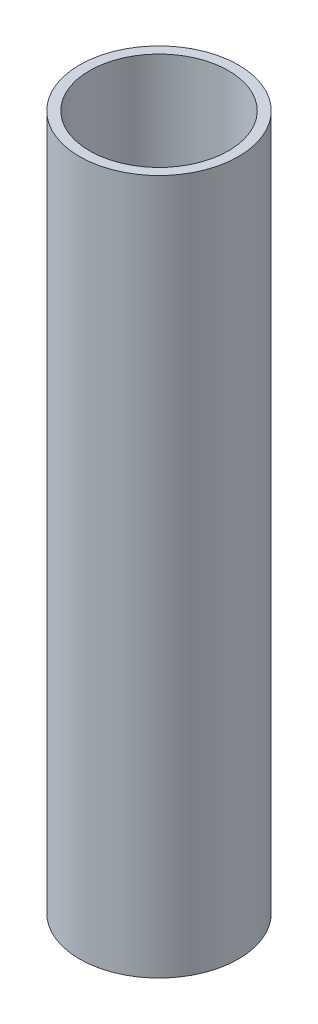
ISO-10303-21;
HEADER;
FILE_DESCRIPTION(('STEP AP214'),'2;1');
FILE_NAME('part.step','',(''),(''),'','','');
FILE_SCHEMA(('AUTOMOTIVE_DESIGN { 1 0 10303 214 1 1 1 1 }'));
ENDSEC;
DATA;
#1=APPLICATION_CONTEXT('core data for automotive mechanical design processes');
#2=APPLICATION_PROTOCOL_DEFINITION('international standard','automotive_design',2000,#1);
#3=PRODUCT_CONTEXT('',#1,'mechanical');
#4=PRODUCT('Part','Part','',(#3));
#5=PRODUCT_RELATED_PRODUCT_CATEGORY('part','',(#4));
#6=PRODUCT_DEFINITION_FORMATION('','',#4);
#7=PRODUCT_DEFINITION_CONTEXT('part definition',#1,'design');
#8=PRODUCT_DEFINITION('design','',#6,#7);
#9=PRODUCT_DEFINITION_SHAPE('','',#8);
#10=(LENGTH_UNIT() NAMED_UNIT(*) SI_UNIT(.MILLI.,.METRE.));
#11=(NAMED_UNIT(*) PLANE_ANGLE_UNIT() SI_UNIT($,.RADIAN.));
#12=(NAMED_UNIT(*) SI_UNIT($,.STERADIAN.) SOLID_ANGLE_UNIT());
#13=UNCERTAINTY_MEASURE_WITH_UNIT(LENGTH_MEASURE(1.E-05),#10,'distance_accuracy_value','');
#14=(GEOMETRIC_REPRESENTATION_CONTEXT(3) GLOBAL_UNCERTAINTY_ASSIGNED_CONTEXT((#13)) GLOBAL_UNIT_ASSIGNED_CONTEXT((#10,
#11,#12)) REPRESENTATION_CONTEXT('',''));
#15=CARTESIAN_POINT('',(0.,0.,0.));
#16=DIRECTION('',(0.,0.,1.));
#17=DIRECTION('',(1.,0.,0.));
#18=AXIS2_PLACEMENT_3D('',#15,#16,#17);
#19=CARTESIAN_POINT('',(0.,35.,0.));
#20=DIRECTION('',(0.,1.,0.));
#21=DIRECTION('',(0.,0.,1.));
#22=AXIS2_PLACEMENT_3D('',#19,#20,#21);
#23=PLANE('',#22);
#24=CARTESIAN_POINT('',(0.,35.,0.));
#25=DIRECTION('',(0.,1.,0.));
#26=DIRECTION('',(0.,0.,1.));
#27=AXIS2_PLACEMENT_3D('',#24,#25,#26);
#28=CIRCLE('',#27,4.);
#29=CARTESIAN_POINT('',(0.,35.,4.));
#30=VERTEX_POINT('',#29);
#31=EDGE_CURVE('E10',#30,#30,#28,.T.);
#32=ORIENTED_EDGE('',*,*,#31,.T.);
#33=EDGE_LOOP('',(#32));
#34=FACE_BOUND('',#33,.T.);
#35=CARTESIAN_POINT('',(0.,35.,0.));
#36=DIRECTION('',(0.,1.,0.));
#37=DIRECTION('',(0.,0.,1.));
#38=AXIS2_PLACEMENT_3D('',#35,#36,#37);
#39=CIRCLE('',#38,3.5);
#40=CARTESIAN_POINT('',(0.,35.,3.5));
#41=VERTEX_POINT('',#40);
#42=EDGE_CURVE('E44',#41,#41,#39,.T.);
#43=ORIENTED_EDGE('',*,*,#42,.F.);
#44=EDGE_LOOP('',(#43));
#45=FACE_BOUND('',#44,.T.);
#46=ADVANCED_FACE('F33',(#34,#45),#23,.T.);
#47=CARTESIAN_POINT('',(0.,0.,0.));
#48=DIRECTION('',(0.,1.,0.));
#49=DIRECTION('',(0.,0.,1.));
#50=AXIS2_PLACEMENT_3D('',#47,#48,#49);
#51=PLANE('',#50);
#52=CARTESIAN_POINT('',(0.,0.,0.));
#53=DIRECTION('',(0.,1.,0.));
#54=DIRECTION('',(0.,0.,1.));
#55=AXIS2_PLACEMENT_3D('',#52,#53,#54);
#56=CIRCLE('',#55,4.);
#57=CARTESIAN_POINT('',(0.,0.,4.));
#58=VERTEX_POINT('',#57);
#59=EDGE_CURVE('E37',#58,#58,#56,.T.);
#60=ORIENTED_EDGE('',*,*,#59,.F.);
#61=EDGE_LOOP('',(#60));
#62=FACE_BOUND('',#61,.T.);
#63=CARTESIAN_POINT('',(0.,0.,0.));
#64=DIRECTION('',(0.,1.,0.));
#65=DIRECTION('',(0.,0.,1.));
#66=AXIS2_PLACEMENT_3D('',#63,#64,#65);
#67=CIRCLE('',#66,3.5);
#68=CARTESIAN_POINT('',(0.,0.,3.5));
#69=VERTEX_POINT('',#68);
#70=EDGE_CURVE('E46',#69,#69,#67,.T.);
#71=ORIENTED_EDGE('',*,*,#70,.T.);
#72=EDGE_LOOP('',(#71));
#73=FACE_BOUND('',#72,.T.);
#74=ADVANCED_FACE('F56',(#62,#73),#51,.F.);
#75=CARTESIAN_POINT('',(0.,35.,0.));
#76=DIRECTION('',(0.,-1.,0.));
#77=DIRECTION('',(0.,0.,-1.));
#78=AXIS2_PLACEMENT_3D('',#75,#76,#77);
#79=CYLINDRICAL_SURFACE('',#78,4.);
#80=ORIENTED_EDGE('',*,*,#31,.F.);
#81=EDGE_LOOP('',(#80));
#82=FACE_BOUND('',#81,.T.);
#83=ORIENTED_EDGE('',*,*,#59,.T.);
#84=EDGE_LOOP('',(#83));
#85=FACE_BOUND('',#84,.T.);
#86=ADVANCED_FACE('F35',(#82,#85),#79,.T.);
#87=CARTESIAN_POINT('',(0.,35.,0.));
#88=DIRECTION('',(0.,-1.,0.));
#89=DIRECTION('',(0.,0.,-1.));
#90=AXIS2_PLACEMENT_3D('',#87,#88,#89);
#91=CYLINDRICAL_SURFACE('',#90,3.5);
#92=ORIENTED_EDGE('',*,*,#42,.T.);
#93=EDGE_LOOP('',(#92));
#94=FACE_BOUND('',#93,.T.);
#95=ORIENTED_EDGE('',*,*,#70,.F.);
#96=EDGE_LOOP('',(#95));
#97=FACE_BOUND('',#96,.T.);
#98=ADVANCED_FACE('F52',(#94,#97),#91,.F.);
#99=CLOSED_SHELL('',(#46,#74,#86,#98));
#100=MANIFOLD_SOLID_BREP('B2',#99);
#101=ADVANCED_BREP_SHAPE_REPRESENTATION('',(#18,#100),#14);
#102=SHAPE_DEFINITION_REPRESENTATION(#9,#101);
ENDSEC;
END-ISO-10303-21;
